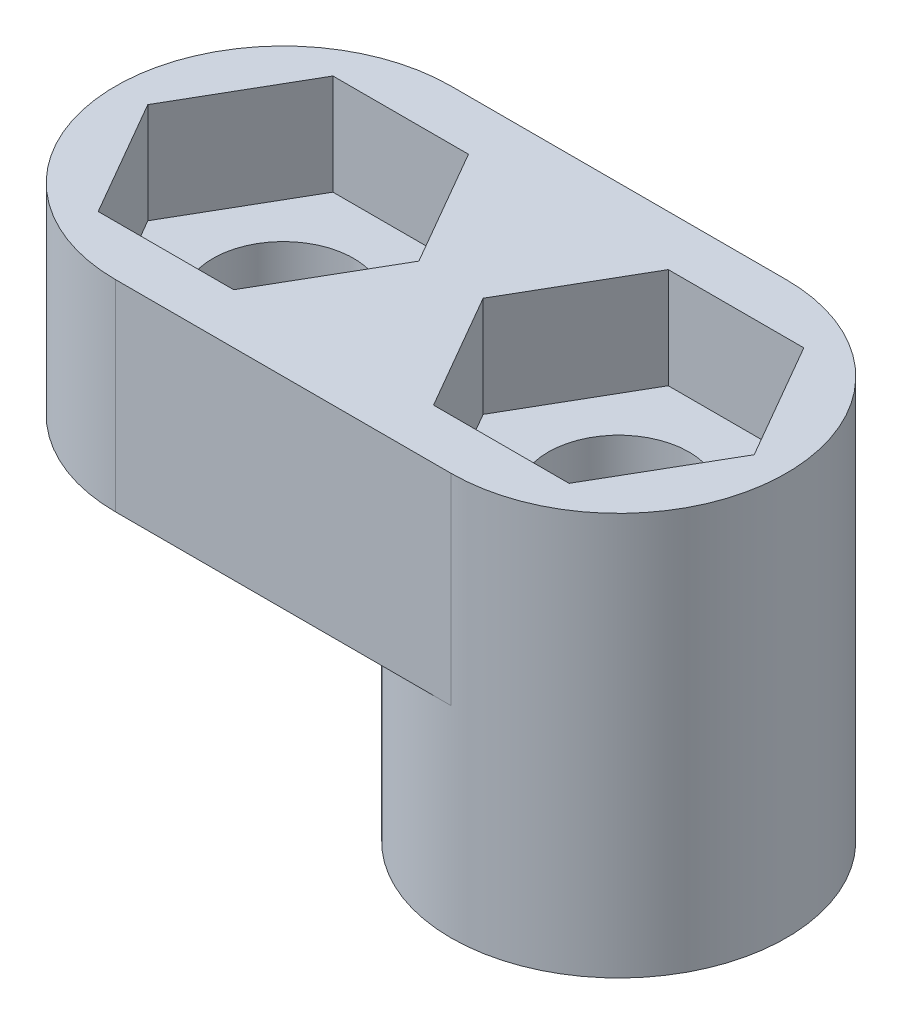
ISO-10303-21;
HEADER;
FILE_DESCRIPTION(('STEP AP214'),'2;1');
FILE_NAME('part.step','',(''),(''),'','','');
FILE_SCHEMA(('AUTOMOTIVE_DESIGN { 1 0 10303 214 1 1 1 1 }'));
ENDSEC;
DATA;
#1=APPLICATION_CONTEXT('core data for automotive mechanical design processes');
#2=APPLICATION_PROTOCOL_DEFINITION('international standard','automotive_design',2000,#1);
#3=PRODUCT_CONTEXT('',#1,'mechanical');
#4=PRODUCT('Part','Part','',(#3));
#5=PRODUCT_RELATED_PRODUCT_CATEGORY('part','',(#4));
#6=PRODUCT_DEFINITION_FORMATION('','',#4);
#7=PRODUCT_DEFINITION_CONTEXT('part definition',#1,'design');
#8=PRODUCT_DEFINITION('design','',#6,#7);
#9=PRODUCT_DEFINITION_SHAPE('','',#8);
#10=(LENGTH_UNIT() NAMED_UNIT(*) SI_UNIT(.MILLI.,.METRE.));
#11=(NAMED_UNIT(*) PLANE_ANGLE_UNIT() SI_UNIT($,.RADIAN.));
#12=(NAMED_UNIT(*) SI_UNIT($,.STERADIAN.) SOLID_ANGLE_UNIT());
#13=UNCERTAINTY_MEASURE_WITH_UNIT(LENGTH_MEASURE(1.E-05),#10,'distance_accuracy_value','');
#14=(GEOMETRIC_REPRESENTATION_CONTEXT(3) GLOBAL_UNCERTAINTY_ASSIGNED_CONTEXT((#13)) GLOBAL_UNIT_ASSIGNED_CONTEXT((#10,
#11,#12)) REPRESENTATION_CONTEXT('',''));
#15=CARTESIAN_POINT('',(0.,0.,0.));
#16=DIRECTION('',(0.,0.,1.));
#17=DIRECTION('',(1.,0.,0.));
#18=AXIS2_PLACEMENT_3D('',#15,#16,#17);
#19=CARTESIAN_POINT('',(5.,3.,0.));
#20=DIRECTION('',(0.,-1.,0.));
#21=DIRECTION('',(0.,0.,-1.));
#22=AXIS2_PLACEMENT_3D('',#19,#20,#21);
#23=CYLINDRICAL_SURFACE('',#22,2.1);
#24=CARTESIAN_POINT('',(5.,0.,0.));
#25=DIRECTION('',(0.,1.,0.));
#26=DIRECTION('',(0.,0.,1.));
#27=AXIS2_PLACEMENT_3D('',#24,#25,#26);
#28=CIRCLE('',#27,2.1);
#29=CARTESIAN_POINT('',(5.,0.,2.1));
#30=VERTEX_POINT('',#29);
#31=EDGE_CURVE('E47',#30,#30,#28,.T.);
#32=ORIENTED_EDGE('',*,*,#31,.T.);
#33=EDGE_LOOP('',(#32));
#34=FACE_BOUND('',#33,.T.);
#35=CARTESIAN_POINT('',(5.,-9.,0.));
#36=DIRECTION('',(0.,-1.,0.));
#37=DIRECTION('',(0.,0.,-1.));
#38=AXIS2_PLACEMENT_3D('',#35,#36,#37);
#39=CIRCLE('',#38,2.1);
#40=CARTESIAN_POINT('',(5.,-9.,-2.1));
#41=VERTEX_POINT('',#40);
#42=EDGE_CURVE('E473',#41,#41,#39,.T.);
#43=ORIENTED_EDGE('',*,*,#42,.T.);
#44=EDGE_LOOP('',(#43));
#45=FACE_BOUND('',#44,.T.);
#46=ADVANCED_FACE('F43',(#34,#45),#23,.F.);
#47=CARTESIAN_POINT('',(-5.,3.,0.));
#48=DIRECTION('',(0.,-1.,0.));
#49=DIRECTION('',(0.,0.,-1.));
#50=AXIS2_PLACEMENT_3D('',#47,#48,#49);
#51=CYLINDRICAL_SURFACE('',#50,2.1);
#52=CARTESIAN_POINT('',(-5.,-3.,0.));
#53=DIRECTION('',(0.,1.,0.));
#54=DIRECTION('',(0.,0.,1.));
#55=AXIS2_PLACEMENT_3D('',#52,#53,#54);
#56=CIRCLE('',#55,2.1);
#57=CARTESIAN_POINT('',(-5.,-3.,2.1));
#58=VERTEX_POINT('',#57);
#59=EDGE_CURVE('E204',#58,#58,#56,.T.);
#60=ORIENTED_EDGE('',*,*,#59,.F.);
#61=EDGE_LOOP('',(#60));
#62=FACE_BOUND('',#61,.T.);
#63=CARTESIAN_POINT('',(-5.,0.,0.));
#64=DIRECTION('',(0.,1.,0.));
#65=DIRECTION('',(0.,0.,1.));
#66=AXIS2_PLACEMENT_3D('',#63,#64,#65);
#67=CIRCLE('',#66,2.1);
#68=CARTESIAN_POINT('',(-5.,0.,2.1));
#69=VERTEX_POINT('',#68);
#70=EDGE_CURVE('E195',#69,#69,#67,.T.);
#71=ORIENTED_EDGE('',*,*,#70,.T.);
#72=EDGE_LOOP('',(#71));
#73=FACE_BOUND('',#72,.T.);
#74=ADVANCED_FACE('F323',(#62,#73),#51,.F.);
#75=CARTESIAN_POINT('',(-5.,3.,0.));
#76=DIRECTION('',(0.,1.,0.));
#77=DIRECTION('',(0.,0.,1.));
#78=AXIS2_PLACEMENT_3D('',#75,#76,#77);
#79=PLANE('',#78);
#80=DIRECTION('',(-0.500000000000002,0.,0.866025403784438));
#81=VECTOR('',#80,1.);
#82=CARTESIAN_POINT('',(-7.02072594216368,3.,-3.50000000000001));
#83=LINE('',#82,#81);
#84=CARTESIAN_POINT('',(-7.02072594216368,3.,-3.50000000000001));
#85=VERTEX_POINT('',#84);
#86=CARTESIAN_POINT('',(-9.04145188432738,3.,0.));
#87=VERTEX_POINT('',#86);
#88=EDGE_CURVE('E61',#85,#87,#83,.T.);
#89=ORIENTED_EDGE('',*,*,#88,.F.);
#90=DIRECTION('',(-1.,0.,0.));
#91=VECTOR('',#90,1.);
#92=CARTESIAN_POINT('',(-2.9792740578363,3.,-3.5));
#93=LINE('',#92,#91);
#94=CARTESIAN_POINT('',(-2.9792740578363,3.,-3.5));
#95=VERTEX_POINT('',#94);
#96=EDGE_CURVE('E213',#95,#85,#93,.T.);
#97=ORIENTED_EDGE('',*,*,#96,.F.);
#98=DIRECTION('',(-0.499999999999998,0.,-0.86602540378444));
#99=VECTOR('',#98,1.);
#100=CARTESIAN_POINT('',(-0.958548115672623,3.,0.));
#101=LINE('',#100,#99);
#102=CARTESIAN_POINT('',(-0.958548115672623,3.,0.));
#103=VERTEX_POINT('',#102);
#104=EDGE_CURVE('E439',#103,#95,#101,.T.);
#105=ORIENTED_EDGE('',*,*,#104,.F.);
#106=DIRECTION('',(0.500000000000001,0.,-0.866025403784438));
#107=VECTOR('',#106,1.);
#108=CARTESIAN_POINT('',(-2.97927405783632,3.,3.5));
#109=LINE('',#108,#107);
#110=CARTESIAN_POINT('',(-2.97927405783632,3.,3.5));
#111=VERTEX_POINT('',#110);
#112=EDGE_CURVE('E432',#111,#103,#109,.T.);
#113=ORIENTED_EDGE('',*,*,#112,.F.);
#114=DIRECTION('',(1.,0.,0.));
#115=VECTOR('',#114,1.);
#116=CARTESIAN_POINT('',(-7.0207259421637,3.,3.49999999999999));
#117=LINE('',#116,#115);
#118=CARTESIAN_POINT('',(-7.0207259421637,3.,3.49999999999999));
#119=VERTEX_POINT('',#118);
#120=EDGE_CURVE('E425',#119,#111,#117,.T.);
#121=ORIENTED_EDGE('',*,*,#120,.F.);
#122=DIRECTION('',(0.499999999999998,0.,0.86602540378444));
#123=VECTOR('',#122,1.);
#124=CARTESIAN_POINT('',(-9.04145188432738,3.,0.));
#125=LINE('',#124,#123);
#126=EDGE_CURVE('E433',#87,#119,#125,.T.);
#127=ORIENTED_EDGE('',*,*,#126,.F.);
#128=EDGE_LOOP('',(#89,#97,#105,#113,#121,#127));
#129=FACE_BOUND('',#128,.T.);
#130=DIRECTION('',(0.5,0.,-0.866025403784439));
#131=VECTOR('',#130,1.);
#132=CARTESIAN_POINT('',(7.02072594216369,3.,3.5));
#133=LINE('',#132,#131);
#134=CARTESIAN_POINT('',(7.02072594216369,3.,3.5));
#135=VERTEX_POINT('',#134);
#136=CARTESIAN_POINT('',(9.04145188432738,3.,0.));
#137=VERTEX_POINT('',#136);
#138=EDGE_CURVE('E69',#135,#137,#133,.T.);
#139=ORIENTED_EDGE('',*,*,#138,.F.);
#140=DIRECTION('',(1.,0.,0.));
#141=VECTOR('',#140,1.);
#142=CARTESIAN_POINT('',(2.97927405783631,3.,3.5));
#143=LINE('',#142,#141);
#144=CARTESIAN_POINT('',(2.97927405783631,3.,3.5));
#145=VERTEX_POINT('',#144);
#146=EDGE_CURVE('E248',#145,#135,#143,.T.);
#147=ORIENTED_EDGE('',*,*,#146,.F.);
#148=DIRECTION('',(0.5,0.,0.866025403784439));
#149=VECTOR('',#148,1.);
#150=CARTESIAN_POINT('',(0.95854811567262,3.,0.));
#151=LINE('',#150,#149);
#152=CARTESIAN_POINT('',(0.95854811567262,3.,0.));
#153=VERTEX_POINT('',#152);
#154=EDGE_CURVE('E252',#153,#145,#151,.T.);
#155=ORIENTED_EDGE('',*,*,#154,.F.);
#156=DIRECTION('',(-0.5,0.,0.866025403784439));
#157=VECTOR('',#156,1.);
#158=CARTESIAN_POINT('',(2.97927405783631,3.,-3.5));
#159=LINE('',#158,#157);
#160=CARTESIAN_POINT('',(2.97927405783631,3.,-3.5));
#161=VERTEX_POINT('',#160);
#162=EDGE_CURVE('E257',#161,#153,#159,.T.);
#163=ORIENTED_EDGE('',*,*,#162,.F.);
#164=DIRECTION('',(-1.,0.,0.));
#165=VECTOR('',#164,1.);
#166=CARTESIAN_POINT('',(7.02072594216369,3.,-3.5));
#167=LINE('',#166,#165);
#168=CARTESIAN_POINT('',(7.02072594216369,3.,-3.5));
#169=VERTEX_POINT('',#168);
#170=EDGE_CURVE('E261',#169,#161,#167,.T.);
#171=ORIENTED_EDGE('',*,*,#170,.F.);
#172=DIRECTION('',(-0.5,0.,-0.866025403784438));
#173=VECTOR('',#172,1.);
#174=CARTESIAN_POINT('',(9.04145188432738,3.,0.));
#175=LINE('',#174,#173);
#176=EDGE_CURVE('E265',#137,#169,#175,.T.);
#177=ORIENTED_EDGE('',*,*,#176,.F.);
#178=EDGE_LOOP('',(#139,#147,#155,#163,#171,#177));
#179=FACE_BOUND('',#178,.T.);
#180=CARTESIAN_POINT('',(-5.,3.,0.));
#181=DIRECTION('',(0.,1.,0.));
#182=DIRECTION('',(0.,0.,1.));
#183=AXIS2_PLACEMENT_3D('',#180,#181,#182);
#184=CIRCLE('',#183,5.);
#185=CARTESIAN_POINT('',(-5.,3.,-5.));
#186=VERTEX_POINT('',#185);
#187=CARTESIAN_POINT('',(-5.,3.,5.));
#188=VERTEX_POINT('',#187);
#189=EDGE_CURVE('E169',#186,#188,#184,.T.);
#190=ORIENTED_EDGE('',*,*,#189,.T.);
#191=DIRECTION('',(1.,0.,0.));
#192=VECTOR('',#191,1.);
#193=CARTESIAN_POINT('',(-5.,3.,5.));
#194=LINE('',#193,#192);
#195=CARTESIAN_POINT('',(5.,3.,5.));
#196=VERTEX_POINT('',#195);
#197=EDGE_CURVE('E299',#188,#196,#194,.T.);
#198=ORIENTED_EDGE('',*,*,#197,.T.);
#199=CARTESIAN_POINT('',(5.,3.,0.));
#200=DIRECTION('',(0.,1.,0.));
#201=DIRECTION('',(0.,0.,1.));
#202=AXIS2_PLACEMENT_3D('',#199,#200,#201);
#203=CIRCLE('',#202,5.);
#204=CARTESIAN_POINT('',(5.,3.,-5.));
#205=VERTEX_POINT('',#204);
#206=EDGE_CURVE('E187',#196,#205,#203,.T.);
#207=ORIENTED_EDGE('',*,*,#206,.T.);
#208=DIRECTION('',(-1.,0.,0.));
#209=VECTOR('',#208,1.);
#210=CARTESIAN_POINT('',(-5.,3.,-5.));
#211=LINE('',#210,#209);
#212=EDGE_CURVE('E176',#205,#186,#211,.T.);
#213=ORIENTED_EDGE('',*,*,#212,.T.);
#214=EDGE_LOOP('',(#190,#198,#207,#213));
#215=FACE_BOUND('',#214,.T.);
#216=ADVANCED_FACE('F314',(#129,#179,#215),#79,.T.);
#217=CARTESIAN_POINT('',(-5.,-3.,0.));
#218=DIRECTION('',(0.,1.,0.));
#219=DIRECTION('',(0.,0.,1.));
#220=AXIS2_PLACEMENT_3D('',#217,#218,#219);
#221=PLANE('',#220);
#222=CARTESIAN_POINT('',(5.,-3.,0.));
#223=DIRECTION('',(0.,-1.,0.));
#224=DIRECTION('',(0.,0.,-1.));
#225=AXIS2_PLACEMENT_3D('',#222,#223,#224);
#226=CIRCLE('',#225,5.);
#227=CARTESIAN_POINT('',(5.,-3.,5.));
#228=VERTEX_POINT('',#227);
#229=CARTESIAN_POINT('',(5.,-3.,-5.));
#230=VERTEX_POINT('',#229);
#231=EDGE_CURVE('E11',#228,#230,#226,.T.);
#232=ORIENTED_EDGE('',*,*,#231,.F.);
#233=DIRECTION('',(1.,0.,0.));
#234=VECTOR('',#233,1.);
#235=CARTESIAN_POINT('',(-5.,-3.,5.));
#236=LINE('',#235,#234);
#237=CARTESIAN_POINT('',(-5.,-3.,5.));
#238=VERTEX_POINT('',#237);
#239=EDGE_CURVE('E170',#238,#228,#236,.T.);
#240=ORIENTED_EDGE('',*,*,#239,.F.);
#241=CARTESIAN_POINT('',(-5.,-3.,0.));
#242=DIRECTION('',(0.,1.,0.));
#243=DIRECTION('',(0.,0.,1.));
#244=AXIS2_PLACEMENT_3D('',#241,#242,#243);
#245=CIRCLE('',#244,5.);
#246=CARTESIAN_POINT('',(-5.,-3.,-5.));
#247=VERTEX_POINT('',#246);
#248=EDGE_CURVE('E164',#247,#238,#245,.T.);
#249=ORIENTED_EDGE('',*,*,#248,.F.);
#250=DIRECTION('',(-1.,0.,0.));
#251=VECTOR('',#250,1.);
#252=CARTESIAN_POINT('',(-5.,-3.,-5.));
#253=LINE('',#252,#251);
#254=EDGE_CURVE('E158',#230,#247,#253,.T.);
#255=ORIENTED_EDGE('',*,*,#254,.F.);
#256=EDGE_LOOP('',(#232,#240,#249,#255));
#257=FACE_BOUND('',#256,.T.);
#258=ORIENTED_EDGE('',*,*,#59,.T.);
#259=EDGE_LOOP('',(#258));
#260=FACE_BOUND('',#259,.T.);
#261=ADVANCED_FACE('F160',(#257,#260),#221,.F.);
#262=CARTESIAN_POINT('',(-5.,3.,0.));
#263=DIRECTION('',(0.,-1.,0.));
#264=DIRECTION('',(0.,0.,-1.));
#265=AXIS2_PLACEMENT_3D('',#262,#263,#264);
#266=CYLINDRICAL_SURFACE('',#265,5.);
#267=ORIENTED_EDGE('',*,*,#248,.T.);
#268=DIRECTION('',(0.,-1.,0.));
#269=VECTOR('',#268,1.);
#270=CARTESIAN_POINT('',(-5.,3.,5.));
#271=LINE('',#270,#269);
#272=EDGE_CURVE('E53',#188,#238,#271,.T.);
#273=ORIENTED_EDGE('',*,*,#272,.F.);
#274=ORIENTED_EDGE('',*,*,#189,.F.);
#275=DIRECTION('',(0.,-1.,0.));
#276=VECTOR('',#275,1.);
#277=CARTESIAN_POINT('',(-5.,3.,-5.));
#278=LINE('',#277,#276);
#279=EDGE_CURVE('E181',#186,#247,#278,.T.);
#280=ORIENTED_EDGE('',*,*,#279,.T.);
#281=EDGE_LOOP('',(#267,#273,#274,#280));
#282=FACE_BOUND('',#281,.T.);
#283=ADVANCED_FACE('F45',(#282),#266,.T.);
#284=CARTESIAN_POINT('',(-5.,3.,5.));
#285=DIRECTION('',(0.,0.,-1.));
#286=DIRECTION('',(-1.,0.,0.));
#287=AXIS2_PLACEMENT_3D('',#284,#285,#286);
#288=PLANE('',#287);
#289=ORIENTED_EDGE('',*,*,#239,.T.);
#290=DIRECTION('',(0.,-1.,0.));
#291=VECTOR('',#290,1.);
#292=CARTESIAN_POINT('',(5.,3.,5.));
#293=LINE('',#292,#291);
#294=EDGE_CURVE('E180',#196,#228,#293,.T.);
#295=ORIENTED_EDGE('',*,*,#294,.F.);
#296=ORIENTED_EDGE('',*,*,#197,.F.);
#297=ORIENTED_EDGE('',*,*,#272,.T.);
#298=EDGE_LOOP('',(#289,#295,#296,#297));
#299=FACE_BOUND('',#298,.T.);
#300=ADVANCED_FACE('F315',(#299),#288,.F.);
#301=CARTESIAN_POINT('',(5.,3.,0.));
#302=DIRECTION('',(0.,-1.,0.));
#303=DIRECTION('',(0.,0.,-1.));
#304=AXIS2_PLACEMENT_3D('',#301,#302,#303);
#305=CYLINDRICAL_SURFACE('',#304,5.);
#306=ORIENTED_EDGE('',*,*,#294,.T.);
#307=ORIENTED_EDGE('',*,*,#231,.T.);
#308=DIRECTION('',(0.,-1.,0.));
#309=VECTOR('',#308,1.);
#310=CARTESIAN_POINT('',(5.,3.,-5.));
#311=LINE('',#310,#309);
#312=EDGE_CURVE('E174',#205,#230,#311,.T.);
#313=ORIENTED_EDGE('',*,*,#312,.F.);
#314=ORIENTED_EDGE('',*,*,#206,.F.);
#315=EDGE_LOOP('',(#306,#307,#313,#314));
#316=FACE_BOUND('',#315,.T.);
#317=CARTESIAN_POINT('',(5.,-9.,0.));
#318=DIRECTION('',(0.,-1.,0.));
#319=DIRECTION('',(0.,0.,-1.));
#320=AXIS2_PLACEMENT_3D('',#317,#318,#319);
#321=CIRCLE('',#320,5.);
#322=CARTESIAN_POINT('',(5.,-9.,-5.));
#323=VERTEX_POINT('',#322);
#324=EDGE_CURVE('E247',#323,#323,#321,.T.);
#325=ORIENTED_EDGE('',*,*,#324,.F.);
#326=EDGE_LOOP('',(#325));
#327=FACE_BOUND('',#326,.T.);
#328=ADVANCED_FACE('F184',(#316,#327),#305,.T.);
#329=CARTESIAN_POINT('',(-5.,3.,-5.));
#330=DIRECTION('',(0.,0.,1.));
#331=DIRECTION('',(1.,0.,0.));
#332=AXIS2_PLACEMENT_3D('',#329,#330,#331);
#333=PLANE('',#332);
#334=ORIENTED_EDGE('',*,*,#254,.T.);
#335=ORIENTED_EDGE('',*,*,#279,.F.);
#336=ORIENTED_EDGE('',*,*,#212,.F.);
#337=ORIENTED_EDGE('',*,*,#312,.T.);
#338=EDGE_LOOP('',(#334,#335,#336,#337));
#339=FACE_BOUND('',#338,.T.);
#340=ADVANCED_FACE('F175',(#339),#333,.F.);
#341=CARTESIAN_POINT('',(-7.02072594216368,0.,-3.50000000000001));
#342=DIRECTION('',(-0.866025403784438,0.,-0.500000000000002));
#343=DIRECTION('',(-0.500000000000002,0.,0.866025403784438));
#344=AXIS2_PLACEMENT_3D('',#341,#342,#343);
#345=PLANE('',#344);
#346=ORIENTED_EDGE('',*,*,#88,.T.);
#347=DIRECTION('',(0.,1.,0.));
#348=VECTOR('',#347,1.);
#349=CARTESIAN_POINT('',(-9.04145188432738,0.,0.));
#350=LINE('',#349,#348);
#351=CARTESIAN_POINT('',(-9.04145188432738,0.,0.));
#352=VERTEX_POINT('',#351);
#353=EDGE_CURVE('E224',#352,#87,#350,.T.);
#354=ORIENTED_EDGE('',*,*,#353,.F.);
#355=DIRECTION('',(-0.500000000000002,0.,0.866025403784438));
#356=VECTOR('',#355,1.);
#357=CARTESIAN_POINT('',(-7.02072594216368,0.,-3.50000000000001));
#358=LINE('',#357,#356);
#359=CARTESIAN_POINT('',(-7.02072594216368,0.,-3.50000000000001));
#360=VERTEX_POINT('',#359);
#361=EDGE_CURVE('E467',#360,#352,#358,.T.);
#362=ORIENTED_EDGE('',*,*,#361,.F.);
#363=DIRECTION('',(0.,1.,0.));
#364=VECTOR('',#363,1.);
#365=CARTESIAN_POINT('',(-7.02072594216368,0.,-3.50000000000001));
#366=LINE('',#365,#364);
#367=EDGE_CURVE('E198',#360,#85,#366,.T.);
#368=ORIENTED_EDGE('',*,*,#367,.T.);
#369=EDGE_LOOP('',(#346,#354,#362,#368));
#370=FACE_BOUND('',#369,.T.);
#371=ADVANCED_FACE('F340',(#370),#345,.F.);
#372=CARTESIAN_POINT('',(-2.9792740578363,0.,-3.5));
#373=DIRECTION('',(0.,0.,-1.));
#374=DIRECTION('',(-1.,0.,0.));
#375=AXIS2_PLACEMENT_3D('',#372,#373,#374);
#376=PLANE('',#375);
#377=ORIENTED_EDGE('',*,*,#96,.T.);
#378=ORIENTED_EDGE('',*,*,#367,.F.);
#379=DIRECTION('',(-1.,0.,0.));
#380=VECTOR('',#379,1.);
#381=CARTESIAN_POINT('',(-2.9792740578363,0.,-3.5));
#382=LINE('',#381,#380);
#383=CARTESIAN_POINT('',(-2.9792740578363,0.,-3.5));
#384=VERTEX_POINT('',#383);
#385=EDGE_CURVE('E227',#384,#360,#382,.T.);
#386=ORIENTED_EDGE('',*,*,#385,.F.);
#387=DIRECTION('',(0.,1.,0.));
#388=VECTOR('',#387,1.);
#389=CARTESIAN_POINT('',(-2.9792740578363,0.,-3.5));
#390=LINE('',#389,#388);
#391=EDGE_CURVE('E205',#384,#95,#390,.T.);
#392=ORIENTED_EDGE('',*,*,#391,.T.);
#393=EDGE_LOOP('',(#377,#378,#386,#392));
#394=FACE_BOUND('',#393,.T.);
#395=ADVANCED_FACE('F344',(#394),#376,.F.);
#396=CARTESIAN_POINT('',(-0.958548115672623,0.,0.));
#397=DIRECTION('',(0.86602540378444,0.,-0.499999999999998));
#398=DIRECTION('',(-0.499999999999998,0.,-0.86602540378444));
#399=AXIS2_PLACEMENT_3D('',#396,#397,#398);
#400=PLANE('',#399);
#401=ORIENTED_EDGE('',*,*,#104,.T.);
#402=ORIENTED_EDGE('',*,*,#391,.F.);
#403=DIRECTION('',(-0.499999999999998,0.,-0.86602540378444));
#404=VECTOR('',#403,1.);
#405=CARTESIAN_POINT('',(-0.958548115672623,0.,0.));
#406=LINE('',#405,#404);
#407=CARTESIAN_POINT('',(-0.958548115672623,0.,0.));
#408=VERTEX_POINT('',#407);
#409=EDGE_CURVE('E451',#408,#384,#406,.T.);
#410=ORIENTED_EDGE('',*,*,#409,.F.);
#411=DIRECTION('',(0.,1.,0.));
#412=VECTOR('',#411,1.);
#413=CARTESIAN_POINT('',(-0.958548115672623,0.,0.));
#414=LINE('',#413,#412);
#415=EDGE_CURVE('E210',#408,#103,#414,.T.);
#416=ORIENTED_EDGE('',*,*,#415,.T.);
#417=EDGE_LOOP('',(#401,#402,#410,#416));
#418=FACE_BOUND('',#417,.T.);
#419=ADVANCED_FACE('F349',(#418),#400,.F.);
#420=CARTESIAN_POINT('',(-2.97927405783632,0.,3.5));
#421=DIRECTION('',(0.866025403784438,0.,0.500000000000001));
#422=DIRECTION('',(0.500000000000001,0.,-0.866025403784438));
#423=AXIS2_PLACEMENT_3D('',#420,#421,#422);
#424=PLANE('',#423);
#425=ORIENTED_EDGE('',*,*,#112,.T.);
#426=ORIENTED_EDGE('',*,*,#415,.F.);
#427=DIRECTION('',(0.500000000000001,0.,-0.866025403784438));
#428=VECTOR('',#427,1.);
#429=CARTESIAN_POINT('',(-2.97927405783632,0.,3.5));
#430=LINE('',#429,#428);
#431=CARTESIAN_POINT('',(-2.97927405783632,0.,3.5));
#432=VERTEX_POINT('',#431);
#433=EDGE_CURVE('E455',#432,#408,#430,.T.);
#434=ORIENTED_EDGE('',*,*,#433,.F.);
#435=DIRECTION('',(0.,1.,0.));
#436=VECTOR('',#435,1.);
#437=CARTESIAN_POINT('',(-2.97927405783632,0.,3.5));
#438=LINE('',#437,#436);
#439=EDGE_CURVE('E218',#432,#111,#438,.T.);
#440=ORIENTED_EDGE('',*,*,#439,.T.);
#441=EDGE_LOOP('',(#425,#426,#434,#440));
#442=FACE_BOUND('',#441,.T.);
#443=ADVANCED_FACE('F412',(#442),#424,.F.);
#444=CARTESIAN_POINT('',(-7.0207259421637,0.,3.49999999999999));
#445=DIRECTION('',(0.,0.,1.));
#446=DIRECTION('',(1.,0.,0.));
#447=AXIS2_PLACEMENT_3D('',#444,#445,#446);
#448=PLANE('',#447);
#449=ORIENTED_EDGE('',*,*,#120,.T.);
#450=ORIENTED_EDGE('',*,*,#439,.F.);
#451=DIRECTION('',(1.,0.,0.));
#452=VECTOR('',#451,1.);
#453=CARTESIAN_POINT('',(-7.0207259421637,0.,3.49999999999999));
#454=LINE('',#453,#452);
#455=CARTESIAN_POINT('',(-7.0207259421637,0.,3.49999999999999));
#456=VERTEX_POINT('',#455);
#457=EDGE_CURVE('E459',#456,#432,#454,.T.);
#458=ORIENTED_EDGE('',*,*,#457,.F.);
#459=DIRECTION('',(0.,1.,0.));
#460=VECTOR('',#459,1.);
#461=CARTESIAN_POINT('',(-7.0207259421637,0.,3.49999999999999));
#462=LINE('',#461,#460);
#463=EDGE_CURVE('E221',#456,#119,#462,.T.);
#464=ORIENTED_EDGE('',*,*,#463,.T.);
#465=EDGE_LOOP('',(#449,#450,#458,#464));
#466=FACE_BOUND('',#465,.T.);
#467=ADVANCED_FACE('F415',(#466),#448,.F.);
#468=CARTESIAN_POINT('',(-9.04145188432738,0.,0.));
#469=DIRECTION('',(-0.86602540378444,0.,0.499999999999998));
#470=DIRECTION('',(0.499999999999998,0.,0.86602540378444));
#471=AXIS2_PLACEMENT_3D('',#468,#469,#470);
#472=PLANE('',#471);
#473=ORIENTED_EDGE('',*,*,#126,.T.);
#474=ORIENTED_EDGE('',*,*,#463,.F.);
#475=DIRECTION('',(0.499999999999998,0.,0.86602540378444));
#476=VECTOR('',#475,1.);
#477=CARTESIAN_POINT('',(-9.04145188432738,0.,0.));
#478=LINE('',#477,#476);
#479=EDGE_CURVE('E463',#352,#456,#478,.T.);
#480=ORIENTED_EDGE('',*,*,#479,.F.);
#481=ORIENTED_EDGE('',*,*,#353,.T.);
#482=EDGE_LOOP('',(#473,#474,#480,#481));
#483=FACE_BOUND('',#482,.T.);
#484=ADVANCED_FACE('F354',(#483),#472,.F.);
#485=CARTESIAN_POINT('',(0.,0.,0.));
#486=DIRECTION('',(0.,1.,0.));
#487=DIRECTION('',(0.,0.,1.));
#488=AXIS2_PLACEMENT_3D('',#485,#486,#487);
#489=PLANE('',#488);
#490=ORIENTED_EDGE('',*,*,#70,.F.);
#491=EDGE_LOOP('',(#490));
#492=FACE_BOUND('',#491,.T.);
#493=ORIENTED_EDGE('',*,*,#361,.T.);
#494=ORIENTED_EDGE('',*,*,#479,.T.);
#495=ORIENTED_EDGE('',*,*,#457,.T.);
#496=ORIENTED_EDGE('',*,*,#433,.T.);
#497=ORIENTED_EDGE('',*,*,#409,.T.);
#498=ORIENTED_EDGE('',*,*,#385,.T.);
#499=EDGE_LOOP('',(#493,#494,#495,#496,#497,#498));
#500=FACE_BOUND('',#499,.T.);
#501=ADVANCED_FACE('F360',(#492,#500),#489,.T.);
#502=CARTESIAN_POINT('',(7.02072594216369,0.,3.5));
#503=DIRECTION('',(0.866025403784439,0.,0.5));
#504=DIRECTION('',(0.5,0.,-0.866025403784439));
#505=AXIS2_PLACEMENT_3D('',#502,#503,#504);
#506=PLANE('',#505);
#507=ORIENTED_EDGE('',*,*,#138,.T.);
#508=DIRECTION('',(0.,1.,0.));
#509=VECTOR('',#508,1.);
#510=CARTESIAN_POINT('',(9.04145188432738,0.,0.));
#511=LINE('',#510,#509);
#512=CARTESIAN_POINT('',(9.04145188432738,0.,0.));
#513=VERTEX_POINT('',#512);
#514=EDGE_CURVE('E228',#513,#137,#511,.T.);
#515=ORIENTED_EDGE('',*,*,#514,.F.);
#516=DIRECTION('',(0.5,0.,-0.866025403784439));
#517=VECTOR('',#516,1.);
#518=CARTESIAN_POINT('',(7.02072594216369,0.,3.5));
#519=LINE('',#518,#517);
#520=CARTESIAN_POINT('',(7.02072594216369,0.,3.5));
#521=VERTEX_POINT('',#520);
#522=EDGE_CURVE('E253',#521,#513,#519,.T.);
#523=ORIENTED_EDGE('',*,*,#522,.F.);
#524=DIRECTION('',(0.,1.,0.));
#525=VECTOR('',#524,1.);
#526=CARTESIAN_POINT('',(7.02072594216369,0.,3.5));
#527=LINE('',#526,#525);
#528=EDGE_CURVE('E244',#521,#135,#527,.T.);
#529=ORIENTED_EDGE('',*,*,#528,.T.);
#530=EDGE_LOOP('',(#507,#515,#523,#529));
#531=FACE_BOUND('',#530,.T.);
#532=ADVANCED_FACE('F356',(#531),#506,.F.);
#533=CARTESIAN_POINT('',(2.97927405783631,0.,3.5));
#534=DIRECTION('',(0.,0.,1.));
#535=DIRECTION('',(1.,0.,0.));
#536=AXIS2_PLACEMENT_3D('',#533,#534,#535);
#537=PLANE('',#536);
#538=ORIENTED_EDGE('',*,*,#146,.T.);
#539=ORIENTED_EDGE('',*,*,#528,.F.);
#540=DIRECTION('',(1.,0.,0.));
#541=VECTOR('',#540,1.);
#542=CARTESIAN_POINT('',(2.97927405783631,0.,3.5));
#543=LINE('',#542,#541);
#544=CARTESIAN_POINT('',(2.97927405783631,0.,3.5));
#545=VERTEX_POINT('',#544);
#546=EDGE_CURVE('E231',#545,#521,#543,.T.);
#547=ORIENTED_EDGE('',*,*,#546,.F.);
#548=DIRECTION('',(0.,1.,0.));
#549=VECTOR('',#548,1.);
#550=CARTESIAN_POINT('',(2.97927405783631,0.,3.5));
#551=LINE('',#550,#549);
#552=EDGE_CURVE('E241',#545,#145,#551,.T.);
#553=ORIENTED_EDGE('',*,*,#552,.T.);
#554=EDGE_LOOP('',(#538,#539,#547,#553));
#555=FACE_BOUND('',#554,.T.);
#556=ADVANCED_FACE('F359',(#555),#537,.F.);
#557=CARTESIAN_POINT('',(0.95854811567262,0.,0.));
#558=DIRECTION('',(-0.866025403784438,0.,0.5));
#559=DIRECTION('',(0.5,0.,0.866025403784439));
#560=AXIS2_PLACEMENT_3D('',#557,#558,#559);
#561=PLANE('',#560);
#562=ORIENTED_EDGE('',*,*,#154,.T.);
#563=ORIENTED_EDGE('',*,*,#552,.F.);
#564=DIRECTION('',(0.5,0.,0.866025403784439));
#565=VECTOR('',#564,1.);
#566=CARTESIAN_POINT('',(0.95854811567262,0.,0.));
#567=LINE('',#566,#565);
#568=CARTESIAN_POINT('',(0.95854811567262,0.,0.));
#569=VERTEX_POINT('',#568);
#570=EDGE_CURVE('E274',#569,#545,#567,.T.);
#571=ORIENTED_EDGE('',*,*,#570,.F.);
#572=DIRECTION('',(0.,1.,0.));
#573=VECTOR('',#572,1.);
#574=CARTESIAN_POINT('',(0.95854811567262,0.,0.));
#575=LINE('',#574,#573);
#576=EDGE_CURVE('E238',#569,#153,#575,.T.);
#577=ORIENTED_EDGE('',*,*,#576,.T.);
#578=EDGE_LOOP('',(#562,#563,#571,#577));
#579=FACE_BOUND('',#578,.T.);
#580=ADVANCED_FACE('F373',(#579),#561,.F.);
#581=CARTESIAN_POINT('',(2.97927405783631,0.,-3.5));
#582=DIRECTION('',(-0.866025403784439,0.,-0.5));
#583=DIRECTION('',(-0.5,0.,0.866025403784439));
#584=AXIS2_PLACEMENT_3D('',#581,#582,#583);
#585=PLANE('',#584);
#586=ORIENTED_EDGE('',*,*,#162,.T.);
#587=ORIENTED_EDGE('',*,*,#576,.F.);
#588=DIRECTION('',(-0.5,0.,0.866025403784439));
#589=VECTOR('',#588,1.);
#590=CARTESIAN_POINT('',(2.97927405783631,0.,-3.5));
#591=LINE('',#590,#589);
#592=CARTESIAN_POINT('',(2.97927405783631,0.,-3.5));
#593=VERTEX_POINT('',#592);
#594=EDGE_CURVE('E278',#593,#569,#591,.T.);
#595=ORIENTED_EDGE('',*,*,#594,.F.);
#596=DIRECTION('',(0.,1.,0.));
#597=VECTOR('',#596,1.);
#598=CARTESIAN_POINT('',(2.97927405783631,0.,-3.5));
#599=LINE('',#598,#597);
#600=EDGE_CURVE('E235',#593,#161,#599,.T.);
#601=ORIENTED_EDGE('',*,*,#600,.T.);
#602=EDGE_LOOP('',(#586,#587,#595,#601));
#603=FACE_BOUND('',#602,.T.);
#604=ADVANCED_FACE('F369',(#603),#585,.F.);
#605=CARTESIAN_POINT('',(7.02072594216369,0.,-3.5));
#606=DIRECTION('',(0.,0.,-1.));
#607=DIRECTION('',(-1.,0.,0.));
#608=AXIS2_PLACEMENT_3D('',#605,#606,#607);
#609=PLANE('',#608);
#610=ORIENTED_EDGE('',*,*,#170,.T.);
#611=ORIENTED_EDGE('',*,*,#600,.F.);
#612=DIRECTION('',(-1.,0.,0.));
#613=VECTOR('',#612,1.);
#614=CARTESIAN_POINT('',(7.02072594216369,0.,-3.5));
#615=LINE('',#614,#613);
#616=CARTESIAN_POINT('',(7.02072594216369,0.,-3.5));
#617=VERTEX_POINT('',#616);
#618=EDGE_CURVE('E282',#617,#593,#615,.T.);
#619=ORIENTED_EDGE('',*,*,#618,.F.);
#620=DIRECTION('',(0.,1.,0.));
#621=VECTOR('',#620,1.);
#622=CARTESIAN_POINT('',(7.02072594216369,0.,-3.5));
#623=LINE('',#622,#621);
#624=EDGE_CURVE('E232',#617,#169,#623,.T.);
#625=ORIENTED_EDGE('',*,*,#624,.T.);
#626=EDGE_LOOP('',(#610,#611,#619,#625));
#627=FACE_BOUND('',#626,.T.);
#628=ADVANCED_FACE('F365',(#627),#609,.F.);
#629=CARTESIAN_POINT('',(9.04145188432738,0.,0.));
#630=DIRECTION('',(0.866025403784438,0.,-0.5));
#631=DIRECTION('',(-0.5,0.,-0.866025403784439));
#632=AXIS2_PLACEMENT_3D('',#629,#630,#631);
#633=PLANE('',#632);
#634=ORIENTED_EDGE('',*,*,#176,.T.);
#635=ORIENTED_EDGE('',*,*,#624,.F.);
#636=DIRECTION('',(-0.5,0.,-0.866025403784438));
#637=VECTOR('',#636,1.);
#638=CARTESIAN_POINT('',(9.04145188432738,0.,0.));
#639=LINE('',#638,#637);
#640=EDGE_CURVE('E286',#513,#617,#639,.T.);
#641=ORIENTED_EDGE('',*,*,#640,.F.);
#642=ORIENTED_EDGE('',*,*,#514,.T.);
#643=EDGE_LOOP('',(#634,#635,#641,#642));
#644=FACE_BOUND('',#643,.T.);
#645=ADVANCED_FACE('F361',(#644),#633,.F.);
#646=CARTESIAN_POINT('',(0.,0.,0.));
#647=DIRECTION('',(0.,1.,0.));
#648=DIRECTION('',(0.,0.,1.));
#649=AXIS2_PLACEMENT_3D('',#646,#647,#648);
#650=PLANE('',#649);
#651=ORIENTED_EDGE('',*,*,#31,.F.);
#652=EDGE_LOOP('',(#651));
#653=FACE_BOUND('',#652,.T.);
#654=ORIENTED_EDGE('',*,*,#522,.T.);
#655=ORIENTED_EDGE('',*,*,#640,.T.);
#656=ORIENTED_EDGE('',*,*,#618,.T.);
#657=ORIENTED_EDGE('',*,*,#594,.T.);
#658=ORIENTED_EDGE('',*,*,#570,.T.);
#659=ORIENTED_EDGE('',*,*,#546,.T.);
#660=EDGE_LOOP('',(#654,#655,#656,#657,#658,#659));
#661=FACE_BOUND('',#660,.T.);
#662=ADVANCED_FACE('F364',(#653,#661),#650,.T.);
#663=CARTESIAN_POINT('',(5.,-9.,0.));
#664=DIRECTION('',(0.,-1.,0.));
#665=DIRECTION('',(0.,0.,-1.));
#666=AXIS2_PLACEMENT_3D('',#663,#664,#665);
#667=PLANE('',#666);
#668=ORIENTED_EDGE('',*,*,#324,.T.);
#669=EDGE_LOOP('',(#668));
#670=FACE_BOUND('',#669,.T.);
#671=ORIENTED_EDGE('',*,*,#42,.F.);
#672=EDGE_LOOP('',(#671));
#673=FACE_BOUND('',#672,.T.);
#674=ADVANCED_FACE('F381',(#670,#673),#667,.T.);
#675=CLOSED_SHELL('',(#46,#74,#216,#261,#283,#300,#328,#340,#371,#395,#419,#443,#467,#484,#501,
#532,#556,#580,#604,#628,#645,#662,#674));
#676=MANIFOLD_SOLID_BREP('B2',#675);
#677=ADVANCED_BREP_SHAPE_REPRESENTATION('',(#18,#676),#14);
#678=SHAPE_DEFINITION_REPRESENTATION(#9,#677);
ENDSEC;
END-ISO-10303-21;
